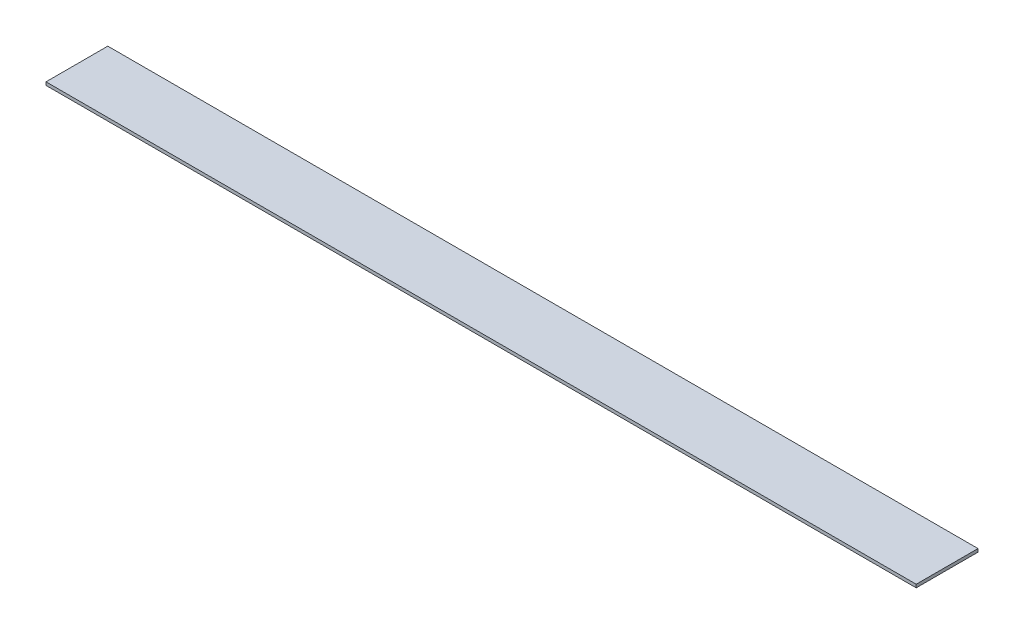
ISO-10303-21;
HEADER;
FILE_DESCRIPTION(('STEP AP214'),'2;1');
FILE_NAME('part.step','',(''),(''),'','','');
FILE_SCHEMA(('AUTOMOTIVE_DESIGN { 1 0 10303 214 1 1 1 1 }'));
ENDSEC;
DATA;
#1=APPLICATION_CONTEXT('core data for automotive mechanical design processes');
#2=APPLICATION_PROTOCOL_DEFINITION('international standard','automotive_design',2000,#1);
#3=PRODUCT_CONTEXT('',#1,'mechanical');
#4=PRODUCT('Part','Part','',(#3));
#5=PRODUCT_RELATED_PRODUCT_CATEGORY('part','',(#4));
#6=PRODUCT_DEFINITION_FORMATION('','',#4);
#7=PRODUCT_DEFINITION_CONTEXT('part definition',#1,'design');
#8=PRODUCT_DEFINITION('design','',#6,#7);
#9=PRODUCT_DEFINITION_SHAPE('','',#8);
#10=(LENGTH_UNIT() NAMED_UNIT(*) SI_UNIT(.MILLI.,.METRE.));
#11=(NAMED_UNIT(*) PLANE_ANGLE_UNIT() SI_UNIT($,.RADIAN.));
#12=(NAMED_UNIT(*) SI_UNIT($,.STERADIAN.) SOLID_ANGLE_UNIT());
#13=UNCERTAINTY_MEASURE_WITH_UNIT(LENGTH_MEASURE(1.E-05),#10,'distance_accuracy_value','');
#14=(GEOMETRIC_REPRESENTATION_CONTEXT(3) GLOBAL_UNCERTAINTY_ASSIGNED_CONTEXT((#13)) GLOBAL_UNIT_ASSIGNED_CONTEXT((#10,
#11,#12)) REPRESENTATION_CONTEXT('',''));
#15=CARTESIAN_POINT('',(0.,0.,0.));
#16=DIRECTION('',(0.,0.,1.));
#17=DIRECTION('',(1.,0.,0.));
#18=AXIS2_PLACEMENT_3D('',#15,#16,#17);
#19=CARTESIAN_POINT('',(0.,0.5,0.));
#20=DIRECTION('',(1.,0.,0.));
#21=DIRECTION('',(0.,0.,-1.));
#22=AXIS2_PLACEMENT_3D('',#19,#20,#21);
#23=PLANE('',#22);
#24=DIRECTION('',(0.,0.,1.));
#25=VECTOR('',#24,1.);
#26=CARTESIAN_POINT('',(0.,0.,0.));
#27=LINE('',#26,#25);
#28=CARTESIAN_POINT('',(0.,0.,-9.8));
#29=VERTEX_POINT('',#28);
#30=CARTESIAN_POINT('',(0.,0.,0.));
#31=VERTEX_POINT('',#30);
#32=EDGE_CURVE('E97',#29,#31,#27,.T.);
#33=ORIENTED_EDGE('',*,*,#32,.T.);
#34=DIRECTION('',(0.,-1.,0.));
#35=VECTOR('',#34,1.);
#36=CARTESIAN_POINT('',(0.,0.5,0.));
#37=LINE('',#36,#35);
#38=CARTESIAN_POINT('',(0.,0.5,0.));
#39=VERTEX_POINT('',#38);
#40=EDGE_CURVE('E11',#39,#31,#37,.T.);
#41=ORIENTED_EDGE('',*,*,#40,.F.);
#42=DIRECTION('',(0.,0.,1.));
#43=VECTOR('',#42,1.);
#44=CARTESIAN_POINT('',(0.,0.5,0.));
#45=LINE('',#44,#43);
#46=CARTESIAN_POINT('',(0.,0.5,-9.8));
#47=VERTEX_POINT('',#46);
#48=EDGE_CURVE('E85',#47,#39,#45,.T.);
#49=ORIENTED_EDGE('',*,*,#48,.F.);
#50=DIRECTION('',(0.,-1.,0.));
#51=VECTOR('',#50,1.);
#52=CARTESIAN_POINT('',(0.,0.5,-9.8));
#53=LINE('',#52,#51);
#54=EDGE_CURVE('E93',#47,#29,#53,.T.);
#55=ORIENTED_EDGE('',*,*,#54,.T.);
#56=EDGE_LOOP('',(#33,#41,#49,#55));
#57=FACE_BOUND('',#56,.T.);
#58=ADVANCED_FACE('F34',(#57),#23,.F.);
#59=CARTESIAN_POINT('',(0.,0.5,0.));
#60=DIRECTION('',(0.,0.,-1.));
#61=DIRECTION('',(-1.,0.,0.));
#62=AXIS2_PLACEMENT_3D('',#59,#60,#61);
#63=PLANE('',#62);
#64=DIRECTION('',(1.,0.,0.));
#65=VECTOR('',#64,1.);
#66=CARTESIAN_POINT('',(0.,0.,0.));
#67=LINE('',#66,#65);
#68=CARTESIAN_POINT('',(138.,0.,0.));
#69=VERTEX_POINT('',#68);
#70=EDGE_CURVE('E89',#31,#69,#67,.T.);
#71=ORIENTED_EDGE('',*,*,#70,.T.);
#72=DIRECTION('',(0.,-1.,0.));
#73=VECTOR('',#72,1.);
#74=CARTESIAN_POINT('',(138.,0.5,0.));
#75=LINE('',#74,#73);
#76=CARTESIAN_POINT('',(138.,0.5,0.));
#77=VERTEX_POINT('',#76);
#78=EDGE_CURVE('E42',#77,#69,#75,.T.);
#79=ORIENTED_EDGE('',*,*,#78,.F.);
#80=DIRECTION('',(1.,0.,0.));
#81=VECTOR('',#80,1.);
#82=CARTESIAN_POINT('',(0.,0.5,0.));
#83=LINE('',#82,#81);
#84=EDGE_CURVE('E80',#39,#77,#83,.T.);
#85=ORIENTED_EDGE('',*,*,#84,.F.);
#86=ORIENTED_EDGE('',*,*,#40,.T.);
#87=EDGE_LOOP('',(#71,#79,#85,#86));
#88=FACE_BOUND('',#87,.T.);
#89=ADVANCED_FACE('F88',(#88),#63,.F.);
#90=CARTESIAN_POINT('',(138.,0.5,0.));
#91=DIRECTION('',(-1.,0.,0.));
#92=DIRECTION('',(0.,0.,1.));
#93=AXIS2_PLACEMENT_3D('',#90,#91,#92);
#94=PLANE('',#93);
#95=DIRECTION('',(0.,0.,-1.));
#96=VECTOR('',#95,1.);
#97=CARTESIAN_POINT('',(138.,0.,0.));
#98=LINE('',#97,#96);
#99=CARTESIAN_POINT('',(138.,0.,-9.8));
#100=VERTEX_POINT('',#99);
#101=EDGE_CURVE('E67',#69,#100,#98,.T.);
#102=ORIENTED_EDGE('',*,*,#101,.T.);
#103=DIRECTION('',(0.,-1.,0.));
#104=VECTOR('',#103,1.);
#105=CARTESIAN_POINT('',(138.,0.5,-9.8));
#106=LINE('',#105,#104);
#107=CARTESIAN_POINT('',(138.,0.5,-9.8));
#108=VERTEX_POINT('',#107);
#109=EDGE_CURVE('E90',#108,#100,#106,.T.);
#110=ORIENTED_EDGE('',*,*,#109,.F.);
#111=DIRECTION('',(0.,0.,-1.));
#112=VECTOR('',#111,1.);
#113=CARTESIAN_POINT('',(138.,0.5,0.));
#114=LINE('',#113,#112);
#115=EDGE_CURVE('E83',#77,#108,#114,.T.);
#116=ORIENTED_EDGE('',*,*,#115,.F.);
#117=ORIENTED_EDGE('',*,*,#78,.T.);
#118=EDGE_LOOP('',(#102,#110,#116,#117));
#119=FACE_BOUND('',#118,.T.);
#120=ADVANCED_FACE('F91',(#119),#94,.F.);
#121=CARTESIAN_POINT('',(0.,0.5,-9.8));
#122=DIRECTION('',(0.,0.,1.));
#123=DIRECTION('',(1.,0.,0.));
#124=AXIS2_PLACEMENT_3D('',#121,#122,#123);
#125=PLANE('',#124);
#126=DIRECTION('',(-1.,0.,0.));
#127=VECTOR('',#126,1.);
#128=CARTESIAN_POINT('',(0.,0.,-9.8));
#129=LINE('',#128,#127);
#130=EDGE_CURVE('E73',#100,#29,#129,.T.);
#131=ORIENTED_EDGE('',*,*,#130,.T.);
#132=ORIENTED_EDGE('',*,*,#54,.F.);
#133=DIRECTION('',(-1.,0.,0.));
#134=VECTOR('',#133,1.);
#135=CARTESIAN_POINT('',(0.,0.5,-9.8));
#136=LINE('',#135,#134);
#137=EDGE_CURVE('E50',#108,#47,#136,.T.);
#138=ORIENTED_EDGE('',*,*,#137,.F.);
#139=ORIENTED_EDGE('',*,*,#109,.T.);
#140=EDGE_LOOP('',(#131,#132,#138,#139));
#141=FACE_BOUND('',#140,.T.);
#142=ADVANCED_FACE('F104',(#141),#125,.F.);
#143=CARTESIAN_POINT('',(0.,0.5,0.));
#144=DIRECTION('',(0.,-1.,0.));
#145=DIRECTION('',(0.,0.,-1.));
#146=AXIS2_PLACEMENT_3D('',#143,#144,#145);
#147=PLANE('',#146);
#148=ORIENTED_EDGE('',*,*,#48,.T.);
#149=ORIENTED_EDGE('',*,*,#84,.T.);
#150=ORIENTED_EDGE('',*,*,#115,.T.);
#151=ORIENTED_EDGE('',*,*,#137,.T.);
#152=EDGE_LOOP('',(#148,#149,#150,#151));
#153=FACE_BOUND('',#152,.T.);
#154=ADVANCED_FACE('F81',(#153),#147,.F.);
#155=CARTESIAN_POINT('',(0.,0.,0.));
#156=DIRECTION('',(0.,-1.,0.));
#157=DIRECTION('',(0.,0.,-1.));
#158=AXIS2_PLACEMENT_3D('',#155,#156,#157);
#159=PLANE('',#158);
#160=ORIENTED_EDGE('',*,*,#32,.F.);
#161=ORIENTED_EDGE('',*,*,#130,.F.);
#162=ORIENTED_EDGE('',*,*,#101,.F.);
#163=ORIENTED_EDGE('',*,*,#70,.F.);
#164=EDGE_LOOP('',(#160,#161,#162,#163));
#165=FACE_BOUND('',#164,.T.);
#166=ADVANCED_FACE('F107',(#165),#159,.T.);
#167=CLOSED_SHELL('',(#58,#89,#120,#142,#154,#166));
#168=MANIFOLD_SOLID_BREP('B2',#167);
#169=ADVANCED_BREP_SHAPE_REPRESENTATION('',(#18,#168),#14);
#170=SHAPE_DEFINITION_REPRESENTATION(#9,#169);
ENDSEC;
END-ISO-10303-21;
